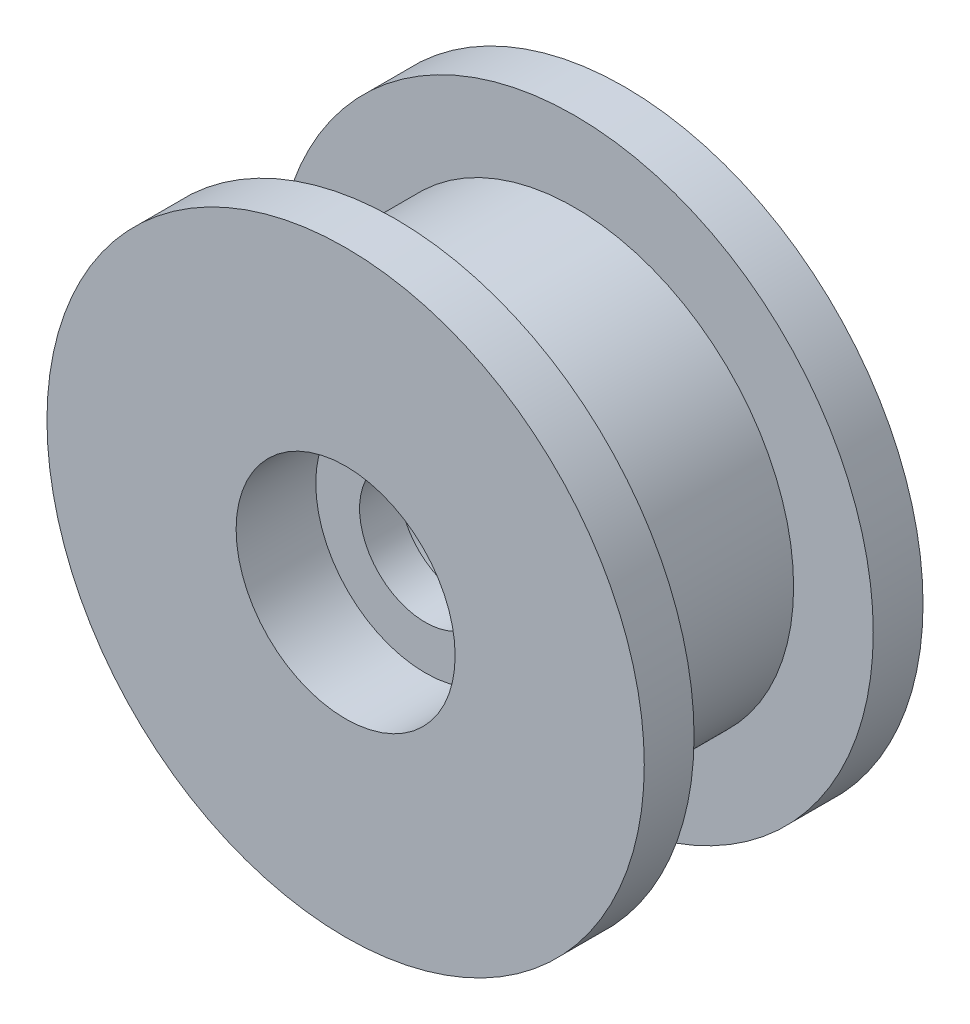
ISO-10303-21;
HEADER;
FILE_DESCRIPTION(('STEP AP214'),'2;1');
FILE_NAME('part.step','',(''),(''),'','','');
FILE_SCHEMA(('AUTOMOTIVE_DESIGN { 1 0 10303 214 1 1 1 1 }'));
ENDSEC;
DATA;
#1=APPLICATION_CONTEXT('core data for automotive mechanical design processes');
#2=APPLICATION_PROTOCOL_DEFINITION('international standard','automotive_design',2000,#1);
#3=PRODUCT_CONTEXT('',#1,'mechanical');
#4=PRODUCT('Part','Part','',(#3));
#5=PRODUCT_RELATED_PRODUCT_CATEGORY('part','',(#4));
#6=PRODUCT_DEFINITION_FORMATION('','',#4);
#7=PRODUCT_DEFINITION_CONTEXT('part definition',#1,'design');
#8=PRODUCT_DEFINITION('design','',#6,#7);
#9=PRODUCT_DEFINITION_SHAPE('','',#8);
#10=(LENGTH_UNIT() NAMED_UNIT(*) SI_UNIT(.MILLI.,.METRE.));
#11=(NAMED_UNIT(*) PLANE_ANGLE_UNIT() SI_UNIT($,.RADIAN.));
#12=(NAMED_UNIT(*) SI_UNIT($,.STERADIAN.) SOLID_ANGLE_UNIT());
#13=UNCERTAINTY_MEASURE_WITH_UNIT(LENGTH_MEASURE(1.E-05),#10,'distance_accuracy_value','');
#14=(GEOMETRIC_REPRESENTATION_CONTEXT(3) GLOBAL_UNCERTAINTY_ASSIGNED_CONTEXT((#13)) GLOBAL_UNIT_ASSIGNED_CONTEXT((#10,
#11,#12)) REPRESENTATION_CONTEXT('',''));
#15=CARTESIAN_POINT('',(0.,0.,0.));
#16=DIRECTION('',(0.,0.,1.));
#17=DIRECTION('',(1.,0.,0.));
#18=AXIS2_PLACEMENT_3D('',#15,#16,#17);
#19=CARTESIAN_POINT('',(0.,0.,0.));
#20=DIRECTION('',(0.,0.,1.));
#21=DIRECTION('',(1.,0.,0.));
#22=AXIS2_PLACEMENT_3D('',#19,#20,#21);
#23=CYLINDRICAL_SURFACE('',#22,1.65);
#24=CARTESIAN_POINT('',(0.,0.,-3.));
#25=DIRECTION('',(0.,0.,1.));
#26=DIRECTION('',(1.,0.,0.));
#27=AXIS2_PLACEMENT_3D('',#24,#25,#26);
#28=CIRCLE('',#27,1.65);
#29=CARTESIAN_POINT('',(1.65,0.,-3.));
#30=VERTEX_POINT('',#29);
#31=EDGE_CURVE('E64',#30,#30,#28,.T.);
#32=ORIENTED_EDGE('',*,*,#31,.F.);
#33=EDGE_LOOP('',(#32));
#34=FACE_BOUND('',#33,.T.);
#35=CARTESIAN_POINT('',(0.,0.,-2.));
#36=DIRECTION('',(0.,0.,1.));
#37=DIRECTION('',(1.,0.,0.));
#38=AXIS2_PLACEMENT_3D('',#35,#36,#37);
#39=CIRCLE('',#38,1.65);
#40=CARTESIAN_POINT('',(1.65,0.,-2.));
#41=VERTEX_POINT('',#40);
#42=EDGE_CURVE('E41',#41,#41,#39,.T.);
#43=ORIENTED_EDGE('',*,*,#42,.T.);
#44=EDGE_LOOP('',(#43));
#45=FACE_BOUND('',#44,.T.);
#46=ADVANCED_FACE('F37',(#34,#45),#23,.F.);
#47=CARTESIAN_POINT('',(0.,0.,0.));
#48=DIRECTION('',(0.,0.,1.));
#49=DIRECTION('',(1.,0.,0.));
#50=AXIS2_PLACEMENT_3D('',#47,#48,#49);
#51=CYLINDRICAL_SURFACE('',#50,2.75);
#52=CARTESIAN_POINT('',(0.,0.,-3.));
#53=DIRECTION('',(0.,0.,1.));
#54=DIRECTION('',(1.,0.,0.));
#55=AXIS2_PLACEMENT_3D('',#52,#53,#54);
#56=CIRCLE('',#55,2.75);
#57=CARTESIAN_POINT('',(2.75,0.,-3.));
#58=VERTEX_POINT('',#57);
#59=EDGE_CURVE('E83',#58,#58,#56,.T.);
#60=ORIENTED_EDGE('',*,*,#59,.T.);
#61=EDGE_LOOP('',(#60));
#62=FACE_BOUND('',#61,.T.);
#63=CARTESIAN_POINT('',(0.,0.,-7.));
#64=DIRECTION('',(0.,0.,-1.));
#65=DIRECTION('',(-1.,0.,0.));
#66=AXIS2_PLACEMENT_3D('',#63,#64,#65);
#67=CIRCLE('',#66,2.75);
#68=CARTESIAN_POINT('',(-2.75,0.,-7.));
#69=VERTEX_POINT('',#68);
#70=EDGE_CURVE('E55',#69,#69,#67,.T.);
#71=ORIENTED_EDGE('',*,*,#70,.T.);
#72=EDGE_LOOP('',(#71));
#73=FACE_BOUND('',#72,.T.);
#74=ADVANCED_FACE('F116',(#62,#73),#51,.F.);
#75=CARTESIAN_POINT('',(0.,0.,0.));
#76=DIRECTION('',(0.,0.,1.));
#77=DIRECTION('',(1.,0.,0.));
#78=AXIS2_PLACEMENT_3D('',#75,#76,#77);
#79=CYLINDRICAL_SURFACE('',#78,7.5);
#80=CARTESIAN_POINT('',(0.,0.,-1.25));
#81=DIRECTION('',(0.,0.,1.));
#82=DIRECTION('',(1.,0.,0.));
#83=AXIS2_PLACEMENT_3D('',#80,#81,#82);
#84=CIRCLE('',#83,7.5);
#85=CARTESIAN_POINT('',(7.5,0.,-1.25));
#86=VERTEX_POINT('',#85);
#87=EDGE_CURVE('E10',#86,#86,#84,.T.);
#88=ORIENTED_EDGE('',*,*,#87,.T.);
#89=EDGE_LOOP('',(#88));
#90=FACE_BOUND('',#89,.T.);
#91=CARTESIAN_POINT('',(0.,0.,0.));
#92=DIRECTION('',(0.,0.,1.));
#93=DIRECTION('',(1.,0.,0.));
#94=AXIS2_PLACEMENT_3D('',#91,#92,#93);
#95=CIRCLE('',#94,7.5);
#96=CARTESIAN_POINT('',(7.5,0.,0.));
#97=VERTEX_POINT('',#96);
#98=EDGE_CURVE('E58',#97,#97,#95,.T.);
#99=ORIENTED_EDGE('',*,*,#98,.F.);
#100=EDGE_LOOP('',(#99));
#101=FACE_BOUND('',#100,.T.);
#102=ADVANCED_FACE('F39',(#90,#101),#79,.T.);
#103=CARTESIAN_POINT('',(7.5,0.,-1.25));
#104=DIRECTION('',(0.,0.,-1.));
#105=DIRECTION('',(-1.,0.,0.));
#106=AXIS2_PLACEMENT_3D('',#103,#104,#105);
#107=PLANE('',#106);
#108=CARTESIAN_POINT('',(0.,0.,-1.25));
#109=DIRECTION('',(0.,0.,1.));
#110=DIRECTION('',(1.,0.,0.));
#111=AXIS2_PLACEMENT_3D('',#108,#109,#110);
#112=CIRCLE('',#111,5.5);
#113=CARTESIAN_POINT('',(5.5,0.,-1.25));
#114=VERTEX_POINT('',#113);
#115=EDGE_CURVE('E46',#114,#114,#112,.T.);
#116=ORIENTED_EDGE('',*,*,#115,.T.);
#117=EDGE_LOOP('',(#116));
#118=FACE_BOUND('',#117,.T.);
#119=ORIENTED_EDGE('',*,*,#87,.F.);
#120=EDGE_LOOP('',(#119));
#121=FACE_BOUND('',#120,.T.);
#122=ADVANCED_FACE('F113',(#118,#121),#107,.T.);
#123=CARTESIAN_POINT('',(0.,0.,0.));
#124=DIRECTION('',(0.,0.,1.));
#125=DIRECTION('',(1.,0.,0.));
#126=AXIS2_PLACEMENT_3D('',#123,#124,#125);
#127=CYLINDRICAL_SURFACE('',#126,5.5);
#128=CARTESIAN_POINT('',(0.,0.,-5.75));
#129=DIRECTION('',(0.,0.,1.));
#130=DIRECTION('',(1.,0.,0.));
#131=AXIS2_PLACEMENT_3D('',#128,#129,#130);
#132=CIRCLE('',#131,5.5);
#133=CARTESIAN_POINT('',(5.5,0.,-5.75));
#134=VERTEX_POINT('',#133);
#135=EDGE_CURVE('E52',#134,#134,#132,.T.);
#136=ORIENTED_EDGE('',*,*,#135,.T.);
#137=EDGE_LOOP('',(#136));
#138=FACE_BOUND('',#137,.T.);
#139=ORIENTED_EDGE('',*,*,#115,.F.);
#140=EDGE_LOOP('',(#139));
#141=FACE_BOUND('',#140,.T.);
#142=ADVANCED_FACE('F98',(#138,#141),#127,.T.);
#143=CARTESIAN_POINT('',(7.5,0.,-5.75));
#144=DIRECTION('',(0.,0.,1.));
#145=DIRECTION('',(1.,0.,0.));
#146=AXIS2_PLACEMENT_3D('',#143,#144,#145);
#147=PLANE('',#146);
#148=CARTESIAN_POINT('',(0.,0.,-5.75));
#149=DIRECTION('',(0.,0.,1.));
#150=DIRECTION('',(1.,0.,0.));
#151=AXIS2_PLACEMENT_3D('',#148,#149,#150);
#152=CIRCLE('',#151,7.5);
#153=CARTESIAN_POINT('',(7.5,0.,-5.75));
#154=VERTEX_POINT('',#153);
#155=EDGE_CURVE('E91',#154,#154,#152,.T.);
#156=ORIENTED_EDGE('',*,*,#155,.T.);
#157=EDGE_LOOP('',(#156));
#158=FACE_BOUND('',#157,.T.);
#159=ORIENTED_EDGE('',*,*,#135,.F.);
#160=EDGE_LOOP('',(#159));
#161=FACE_BOUND('',#160,.T.);
#162=ADVANCED_FACE('F101',(#158,#161),#147,.T.);
#163=CARTESIAN_POINT('',(0.,0.,0.));
#164=DIRECTION('',(0.,0.,1.));
#165=DIRECTION('',(1.,0.,0.));
#166=AXIS2_PLACEMENT_3D('',#163,#164,#165);
#167=CYLINDRICAL_SURFACE('',#166,7.5);
#168=CARTESIAN_POINT('',(0.,0.,-7.));
#169=DIRECTION('',(0.,0.,1.));
#170=DIRECTION('',(1.,0.,0.));
#171=AXIS2_PLACEMENT_3D('',#168,#169,#170);
#172=CIRCLE('',#171,7.5);
#173=CARTESIAN_POINT('',(7.5,0.,-7.));
#174=VERTEX_POINT('',#173);
#175=EDGE_CURVE('E87',#174,#174,#172,.T.);
#176=ORIENTED_EDGE('',*,*,#175,.T.);
#177=EDGE_LOOP('',(#176));
#178=FACE_BOUND('',#177,.T.);
#179=ORIENTED_EDGE('',*,*,#155,.F.);
#180=EDGE_LOOP('',(#179));
#181=FACE_BOUND('',#180,.T.);
#182=ADVANCED_FACE('F103',(#178,#181),#167,.T.);
#183=CARTESIAN_POINT('',(3.,0.,-7.));
#184=DIRECTION('',(0.,0.,-1.));
#185=DIRECTION('',(-1.,0.,0.));
#186=AXIS2_PLACEMENT_3D('',#183,#184,#185);
#187=PLANE('',#186);
#188=ORIENTED_EDGE('',*,*,#175,.F.);
#189=EDGE_LOOP('',(#188));
#190=FACE_BOUND('',#189,.T.);
#191=ORIENTED_EDGE('',*,*,#70,.F.);
#192=EDGE_LOOP('',(#191));
#193=FACE_BOUND('',#192,.T.);
#194=ADVANCED_FACE('F110',(#190,#193),#187,.T.);
#195=CARTESIAN_POINT('',(2.75,0.,-3.));
#196=DIRECTION('',(0.,0.,-1.));
#197=DIRECTION('',(-1.,0.,0.));
#198=AXIS2_PLACEMENT_3D('',#195,#196,#197);
#199=PLANE('',#198);
#200=ORIENTED_EDGE('',*,*,#31,.T.);
#201=EDGE_LOOP('',(#200));
#202=FACE_BOUND('',#201,.T.);
#203=ORIENTED_EDGE('',*,*,#59,.F.);
#204=EDGE_LOOP('',(#203));
#205=FACE_BOUND('',#204,.T.);
#206=ADVANCED_FACE('F129',(#202,#205),#199,.T.);
#207=CARTESIAN_POINT('',(1.65,0.,0.));
#208=DIRECTION('',(0.,0.,1.));
#209=DIRECTION('',(1.,0.,0.));
#210=AXIS2_PLACEMENT_3D('',#207,#208,#209);
#211=PLANE('',#210);
#212=CARTESIAN_POINT('',(0.,0.,0.));
#213=DIRECTION('',(0.,0.,1.));
#214=DIRECTION('',(1.,0.,0.));
#215=AXIS2_PLACEMENT_3D('',#212,#213,#214);
#216=CIRCLE('',#215,2.75);
#217=CARTESIAN_POINT('',(2.75,0.,0.));
#218=VERTEX_POINT('',#217);
#219=EDGE_CURVE('E72',#218,#218,#216,.T.);
#220=ORIENTED_EDGE('',*,*,#219,.F.);
#221=EDGE_LOOP('',(#220));
#222=FACE_BOUND('',#221,.T.);
#223=ORIENTED_EDGE('',*,*,#98,.T.);
#224=EDGE_LOOP('',(#223));
#225=FACE_BOUND('',#224,.T.);
#226=ADVANCED_FACE('F127',(#222,#225),#211,.T.);
#227=CARTESIAN_POINT('',(0.,0.,-2.));
#228=DIRECTION('',(0.,0.,1.));
#229=DIRECTION('',(1.,0.,0.));
#230=AXIS2_PLACEMENT_3D('',#227,#228,#229);
#231=CYLINDRICAL_SURFACE('',#230,2.75);
#232=CARTESIAN_POINT('',(0.,0.,-2.));
#233=DIRECTION('',(0.,0.,1.));
#234=DIRECTION('',(1.,0.,0.));
#235=AXIS2_PLACEMENT_3D('',#232,#233,#234);
#236=CIRCLE('',#235,2.75);
#237=CARTESIAN_POINT('',(2.75,0.,-2.));
#238=VERTEX_POINT('',#237);
#239=EDGE_CURVE('E67',#238,#238,#236,.T.);
#240=ORIENTED_EDGE('',*,*,#239,.F.);
#241=EDGE_LOOP('',(#240));
#242=FACE_BOUND('',#241,.T.);
#243=ORIENTED_EDGE('',*,*,#219,.T.);
#244=EDGE_LOOP('',(#243));
#245=FACE_BOUND('',#244,.T.);
#246=ADVANCED_FACE('F154',(#242,#245),#231,.F.);
#247=CARTESIAN_POINT('',(0.,0.,-2.));
#248=DIRECTION('',(0.,0.,1.));
#249=DIRECTION('',(1.,0.,0.));
#250=AXIS2_PLACEMENT_3D('',#247,#248,#249);
#251=PLANE('',#250);
#252=ORIENTED_EDGE('',*,*,#42,.F.);
#253=EDGE_LOOP('',(#252));
#254=FACE_BOUND('',#253,.T.);
#255=ORIENTED_EDGE('',*,*,#239,.T.);
#256=EDGE_LOOP('',(#255));
#257=FACE_BOUND('',#256,.T.);
#258=ADVANCED_FACE('F161',(#254,#257),#251,.T.);
#259=CLOSED_SHELL('',(#46,#74,#102,#122,#142,#162,#182,#194,#206,#226,#246,#258));
#260=MANIFOLD_SOLID_BREP('B2',#259);
#261=ADVANCED_BREP_SHAPE_REPRESENTATION('',(#18,#260),#14);
#262=SHAPE_DEFINITION_REPRESENTATION(#9,#261);
ENDSEC;
END-ISO-10303-21;
